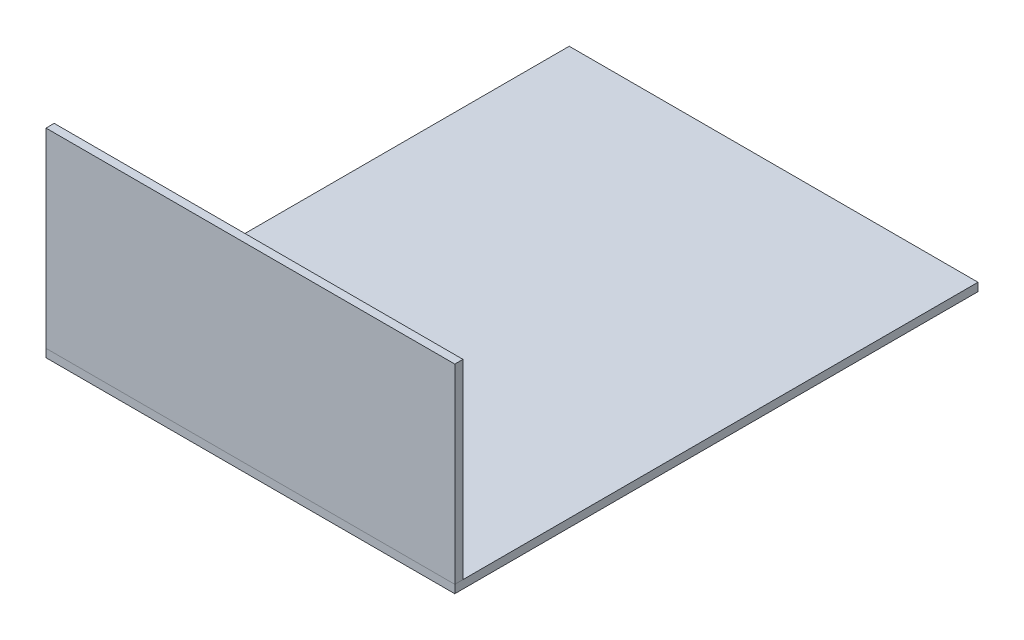
ISO-10303-21;
HEADER;
FILE_DESCRIPTION(('STEP AP214'),'2;1');
FILE_NAME('part.step','',(''),(''),'','','');
FILE_SCHEMA(('AUTOMOTIVE_DESIGN { 1 0 10303 214 1 1 1 1 }'));
ENDSEC;
DATA;
#1=APPLICATION_CONTEXT('core data for automotive mechanical design processes');
#2=APPLICATION_PROTOCOL_DEFINITION('international standard','automotive_design',2000,#1);
#3=PRODUCT_CONTEXT('',#1,'mechanical');
#4=PRODUCT('Part','Part','',(#3));
#5=PRODUCT_RELATED_PRODUCT_CATEGORY('part','',(#4));
#6=PRODUCT_DEFINITION_FORMATION('','',#4);
#7=PRODUCT_DEFINITION_CONTEXT('part definition',#1,'design');
#8=PRODUCT_DEFINITION('design','',#6,#7);
#9=PRODUCT_DEFINITION_SHAPE('','',#8);
#10=(LENGTH_UNIT() NAMED_UNIT(*) SI_UNIT(.MILLI.,.METRE.));
#11=(NAMED_UNIT(*) PLANE_ANGLE_UNIT() SI_UNIT($,.RADIAN.));
#12=(NAMED_UNIT(*) SI_UNIT($,.STERADIAN.) SOLID_ANGLE_UNIT());
#13=UNCERTAINTY_MEASURE_WITH_UNIT(LENGTH_MEASURE(1.E-05),#10,'distance_accuracy_value','');
#14=(GEOMETRIC_REPRESENTATION_CONTEXT(3) GLOBAL_UNCERTAINTY_ASSIGNED_CONTEXT((#13)) GLOBAL_UNIT_ASSIGNED_CONTEXT((#10,
#11,#12)) REPRESENTATION_CONTEXT('',''));
#15=CARTESIAN_POINT('',(0.,0.,0.));
#16=DIRECTION('',(0.,0.,1.));
#17=DIRECTION('',(1.,0.,0.));
#18=AXIS2_PLACEMENT_3D('',#15,#16,#17);
#19=CARTESIAN_POINT('',(-150.,146.,192.));
#20=DIRECTION('',(1.,0.,0.));
#21=DIRECTION('',(0.,0.,-1.));
#22=AXIS2_PLACEMENT_3D('',#19,#20,#21);
#23=PLANE('',#22);
#24=DIRECTION('',(0.,0.,1.));
#25=VECTOR('',#24,1.);
#26=CARTESIAN_POINT('',(-150.,6.,192.));
#27=LINE('',#26,#25);
#28=CARTESIAN_POINT('',(-150.,6.,186.));
#29=VERTEX_POINT('',#28);
#30=CARTESIAN_POINT('',(-150.,6.,192.));
#31=VERTEX_POINT('',#30);
#32=EDGE_CURVE('E108',#29,#31,#27,.T.);
#33=ORIENTED_EDGE('',*,*,#32,.T.);
#34=DIRECTION('',(0.,-1.,0.));
#35=VECTOR('',#34,1.);
#36=CARTESIAN_POINT('',(-150.,146.,192.));
#37=LINE('',#36,#35);
#38=CARTESIAN_POINT('',(-150.,146.,192.));
#39=VERTEX_POINT('',#38);
#40=EDGE_CURVE('E12',#39,#31,#37,.T.);
#41=ORIENTED_EDGE('',*,*,#40,.F.);
#42=DIRECTION('',(0.,0.,1.));
#43=VECTOR('',#42,1.);
#44=CARTESIAN_POINT('',(-150.,146.,192.));
#45=LINE('',#44,#43);
#46=CARTESIAN_POINT('',(-150.,146.,186.));
#47=VERTEX_POINT('',#46);
#48=EDGE_CURVE('E96',#47,#39,#45,.T.);
#49=ORIENTED_EDGE('',*,*,#48,.F.);
#50=DIRECTION('',(0.,-1.,0.));
#51=VECTOR('',#50,1.);
#52=CARTESIAN_POINT('',(-150.,146.,186.));
#53=LINE('',#52,#51);
#54=EDGE_CURVE('E104',#47,#29,#53,.T.);
#55=ORIENTED_EDGE('',*,*,#54,.T.);
#56=EDGE_LOOP('',(#33,#41,#49,#55));
#57=FACE_BOUND('',#56,.T.);
#58=ADVANCED_FACE('F45',(#57),#23,.F.);
#59=CARTESIAN_POINT('',(-150.,146.,192.));
#60=DIRECTION('',(0.,0.,-1.));
#61=DIRECTION('',(-1.,0.,0.));
#62=AXIS2_PLACEMENT_3D('',#59,#60,#61);
#63=PLANE('',#62);
#64=DIRECTION('',(1.,0.,0.));
#65=VECTOR('',#64,1.);
#66=CARTESIAN_POINT('',(-150.,6.,192.));
#67=LINE('',#66,#65);
#68=CARTESIAN_POINT('',(150.,6.,192.));
#69=VERTEX_POINT('',#68);
#70=EDGE_CURVE('E100',#31,#69,#67,.T.);
#71=ORIENTED_EDGE('',*,*,#70,.T.);
#72=DIRECTION('',(0.,-1.,0.));
#73=VECTOR('',#72,1.);
#74=CARTESIAN_POINT('',(150.,146.,192.));
#75=LINE('',#74,#73);
#76=CARTESIAN_POINT('',(150.,146.,192.));
#77=VERTEX_POINT('',#76);
#78=EDGE_CURVE('E53',#77,#69,#75,.T.);
#79=ORIENTED_EDGE('',*,*,#78,.F.);
#80=DIRECTION('',(1.,0.,0.));
#81=VECTOR('',#80,1.);
#82=CARTESIAN_POINT('',(-150.,146.,192.));
#83=LINE('',#82,#81);
#84=EDGE_CURVE('E91',#39,#77,#83,.T.);
#85=ORIENTED_EDGE('',*,*,#84,.F.);
#86=ORIENTED_EDGE('',*,*,#40,.T.);
#87=EDGE_LOOP('',(#71,#79,#85,#86));
#88=FACE_BOUND('',#87,.T.);
#89=ADVANCED_FACE('F99',(#88),#63,.F.);
#90=CARTESIAN_POINT('',(150.,146.,192.));
#91=DIRECTION('',(-1.,0.,0.));
#92=DIRECTION('',(0.,0.,1.));
#93=AXIS2_PLACEMENT_3D('',#90,#91,#92);
#94=PLANE('',#93);
#95=DIRECTION('',(0.,0.,-1.));
#96=VECTOR('',#95,1.);
#97=CARTESIAN_POINT('',(150.,6.,192.));
#98=LINE('',#97,#96);
#99=CARTESIAN_POINT('',(150.,6.,186.));
#100=VERTEX_POINT('',#99);
#101=EDGE_CURVE('E78',#69,#100,#98,.T.);
#102=ORIENTED_EDGE('',*,*,#101,.T.);
#103=DIRECTION('',(0.,-1.,0.));
#104=VECTOR('',#103,1.);
#105=CARTESIAN_POINT('',(150.,146.,186.));
#106=LINE('',#105,#104);
#107=CARTESIAN_POINT('',(150.,146.,186.));
#108=VERTEX_POINT('',#107);
#109=EDGE_CURVE('E101',#108,#100,#106,.T.);
#110=ORIENTED_EDGE('',*,*,#109,.F.);
#111=DIRECTION('',(0.,0.,-1.));
#112=VECTOR('',#111,1.);
#113=CARTESIAN_POINT('',(150.,146.,192.));
#114=LINE('',#113,#112);
#115=EDGE_CURVE('E94',#77,#108,#114,.T.);
#116=ORIENTED_EDGE('',*,*,#115,.F.);
#117=ORIENTED_EDGE('',*,*,#78,.T.);
#118=EDGE_LOOP('',(#102,#110,#116,#117));
#119=FACE_BOUND('',#118,.T.);
#120=ADVANCED_FACE('F102',(#119),#94,.F.);
#121=CARTESIAN_POINT('',(-150.,146.,186.));
#122=DIRECTION('',(0.,0.,1.));
#123=DIRECTION('',(1.,0.,0.));
#124=AXIS2_PLACEMENT_3D('',#121,#122,#123);
#125=PLANE('',#124);
#126=DIRECTION('',(-1.,0.,0.));
#127=VECTOR('',#126,1.);
#128=CARTESIAN_POINT('',(-150.,6.,186.));
#129=LINE('',#128,#127);
#130=EDGE_CURVE('E84',#100,#29,#129,.T.);
#131=ORIENTED_EDGE('',*,*,#130,.T.);
#132=ORIENTED_EDGE('',*,*,#54,.F.);
#133=DIRECTION('',(-1.,0.,0.));
#134=VECTOR('',#133,1.);
#135=CARTESIAN_POINT('',(-150.,146.,186.));
#136=LINE('',#135,#134);
#137=EDGE_CURVE('E61',#108,#47,#136,.T.);
#138=ORIENTED_EDGE('',*,*,#137,.F.);
#139=ORIENTED_EDGE('',*,*,#109,.T.);
#140=EDGE_LOOP('',(#131,#132,#138,#139));
#141=FACE_BOUND('',#140,.T.);
#142=ADVANCED_FACE('F115',(#141),#125,.F.);
#143=CARTESIAN_POINT('',(0.,146.,0.));
#144=DIRECTION('',(0.,-1.,0.));
#145=DIRECTION('',(0.,0.,-1.));
#146=AXIS2_PLACEMENT_3D('',#143,#144,#145);
#147=PLANE('',#146);
#148=ORIENTED_EDGE('',*,*,#48,.T.);
#149=ORIENTED_EDGE('',*,*,#84,.T.);
#150=ORIENTED_EDGE('',*,*,#115,.T.);
#151=ORIENTED_EDGE('',*,*,#137,.T.);
#152=EDGE_LOOP('',(#148,#149,#150,#151));
#153=FACE_BOUND('',#152,.T.);
#154=ADVANCED_FACE('F92',(#153),#147,.F.);
#155=CARTESIAN_POINT('',(0.,6.,0.));
#156=DIRECTION('',(0.,-1.,0.));
#157=DIRECTION('',(0.,0.,-1.));
#158=AXIS2_PLACEMENT_3D('',#155,#156,#157);
#159=PLANE('',#158);
#160=ORIENTED_EDGE('',*,*,#32,.F.);
#161=ORIENTED_EDGE('',*,*,#130,.F.);
#162=ORIENTED_EDGE('',*,*,#101,.F.);
#163=ORIENTED_EDGE('',*,*,#70,.F.);
#164=EDGE_LOOP('',(#160,#161,#162,#163));
#165=FACE_BOUND('',#164,.T.);
#166=ADVANCED_FACE('F118',(#165),#159,.T.);
#167=CLOSED_SHELL('',(#58,#89,#120,#142,#154,#166));
#168=MANIFOLD_SOLID_BREP('B2',#167);
#169=CARTESIAN_POINT('',(150.,6.,-192.));
#170=DIRECTION('',(-1.,0.,0.));
#171=DIRECTION('',(0.,0.,1.));
#172=AXIS2_PLACEMENT_3D('',#169,#170,#171);
#173=PLANE('',#172);
#174=DIRECTION('',(0.,0.,-1.));
#175=VECTOR('',#174,1.);
#176=CARTESIAN_POINT('',(150.,0.,-192.));
#177=LINE('',#176,#175);
#178=CARTESIAN_POINT('',(150.,0.,192.));
#179=VERTEX_POINT('',#178);
#180=CARTESIAN_POINT('',(150.,0.,-192.));
#181=VERTEX_POINT('',#180);
#182=EDGE_CURVE('E232',#179,#181,#177,.T.);
#183=ORIENTED_EDGE('',*,*,#182,.T.);
#184=DIRECTION('',(0.,-1.,0.));
#185=VECTOR('',#184,1.);
#186=CARTESIAN_POINT('',(150.,6.,-192.));
#187=LINE('',#186,#185);
#188=CARTESIAN_POINT('',(150.,6.,-192.));
#189=VERTEX_POINT('',#188);
#190=EDGE_CURVE('E43',#189,#181,#187,.T.);
#191=ORIENTED_EDGE('',*,*,#190,.F.);
#192=DIRECTION('',(0.,0.,-1.));
#193=VECTOR('',#192,1.);
#194=CARTESIAN_POINT('',(150.,6.,-192.));
#195=LINE('',#194,#193);
#196=CARTESIAN_POINT('',(150.,6.,192.));
#197=VERTEX_POINT('',#196);
#198=EDGE_CURVE('E220',#197,#189,#195,.T.);
#199=ORIENTED_EDGE('',*,*,#198,.F.);
#200=DIRECTION('',(0.,-1.,0.));
#201=VECTOR('',#200,1.);
#202=CARTESIAN_POINT('',(150.,6.,192.));
#203=LINE('',#202,#201);
#204=EDGE_CURVE('E228',#197,#179,#203,.T.);
#205=ORIENTED_EDGE('',*,*,#204,.T.);
#206=EDGE_LOOP('',(#183,#191,#199,#205));
#207=FACE_BOUND('',#206,.T.);
#208=ADVANCED_FACE('F169',(#207),#173,.F.);
#209=CARTESIAN_POINT('',(-150.,6.,-192.));
#210=DIRECTION('',(0.,0.,1.));
#211=DIRECTION('',(1.,0.,0.));
#212=AXIS2_PLACEMENT_3D('',#209,#210,#211);
#213=PLANE('',#212);
#214=DIRECTION('',(-1.,0.,0.));
#215=VECTOR('',#214,1.);
#216=CARTESIAN_POINT('',(-150.,0.,-192.));
#217=LINE('',#216,#215);
#218=CARTESIAN_POINT('',(-150.,0.,-192.));
#219=VERTEX_POINT('',#218);
#220=EDGE_CURVE('E224',#181,#219,#217,.T.);
#221=ORIENTED_EDGE('',*,*,#220,.T.);
#222=DIRECTION('',(0.,-1.,0.));
#223=VECTOR('',#222,1.);
#224=CARTESIAN_POINT('',(-150.,6.,-192.));
#225=LINE('',#224,#223);
#226=CARTESIAN_POINT('',(-150.,6.,-192.));
#227=VERTEX_POINT('',#226);
#228=EDGE_CURVE('E177',#227,#219,#225,.T.);
#229=ORIENTED_EDGE('',*,*,#228,.F.);
#230=DIRECTION('',(-1.,0.,0.));
#231=VECTOR('',#230,1.);
#232=CARTESIAN_POINT('',(-150.,6.,-192.));
#233=LINE('',#232,#231);
#234=EDGE_CURVE('E215',#189,#227,#233,.T.);
#235=ORIENTED_EDGE('',*,*,#234,.F.);
#236=ORIENTED_EDGE('',*,*,#190,.T.);
#237=EDGE_LOOP('',(#221,#229,#235,#236));
#238=FACE_BOUND('',#237,.T.);
#239=ADVANCED_FACE('F223',(#238),#213,.F.);
#240=CARTESIAN_POINT('',(-150.,6.,-192.));
#241=DIRECTION('',(1.,0.,0.));
#242=DIRECTION('',(0.,0.,-1.));
#243=AXIS2_PLACEMENT_3D('',#240,#241,#242);
#244=PLANE('',#243);
#245=DIRECTION('',(0.,0.,1.));
#246=VECTOR('',#245,1.);
#247=CARTESIAN_POINT('',(-150.,0.,-192.));
#248=LINE('',#247,#246);
#249=CARTESIAN_POINT('',(-150.,0.,192.));
#250=VERTEX_POINT('',#249);
#251=EDGE_CURVE('E202',#219,#250,#248,.T.);
#252=ORIENTED_EDGE('',*,*,#251,.T.);
#253=DIRECTION('',(0.,-1.,0.));
#254=VECTOR('',#253,1.);
#255=CARTESIAN_POINT('',(-150.,6.,192.));
#256=LINE('',#255,#254);
#257=CARTESIAN_POINT('',(-150.,6.,192.));
#258=VERTEX_POINT('',#257);
#259=EDGE_CURVE('E225',#258,#250,#256,.T.);
#260=ORIENTED_EDGE('',*,*,#259,.F.);
#261=DIRECTION('',(0.,0.,1.));
#262=VECTOR('',#261,1.);
#263=CARTESIAN_POINT('',(-150.,6.,-192.));
#264=LINE('',#263,#262);
#265=EDGE_CURVE('E218',#227,#258,#264,.T.);
#266=ORIENTED_EDGE('',*,*,#265,.F.);
#267=ORIENTED_EDGE('',*,*,#228,.T.);
#268=EDGE_LOOP('',(#252,#260,#266,#267));
#269=FACE_BOUND('',#268,.T.);
#270=ADVANCED_FACE('F226',(#269),#244,.F.);
#271=CARTESIAN_POINT('',(-150.,6.,192.));
#272=DIRECTION('',(0.,0.,-1.));
#273=DIRECTION('',(-1.,0.,0.));
#274=AXIS2_PLACEMENT_3D('',#271,#272,#273);
#275=PLANE('',#274);
#276=DIRECTION('',(1.,0.,0.));
#277=VECTOR('',#276,1.);
#278=CARTESIAN_POINT('',(-150.,0.,192.));
#279=LINE('',#278,#277);
#280=EDGE_CURVE('E208',#250,#179,#279,.T.);
#281=ORIENTED_EDGE('',*,*,#280,.T.);
#282=ORIENTED_EDGE('',*,*,#204,.F.);
#283=DIRECTION('',(1.,0.,0.));
#284=VECTOR('',#283,1.);
#285=CARTESIAN_POINT('',(-150.,6.,192.));
#286=LINE('',#285,#284);
#287=EDGE_CURVE('E185',#258,#197,#286,.T.);
#288=ORIENTED_EDGE('',*,*,#287,.F.);
#289=ORIENTED_EDGE('',*,*,#259,.T.);
#290=EDGE_LOOP('',(#281,#282,#288,#289));
#291=FACE_BOUND('',#290,.T.);
#292=ADVANCED_FACE('F239',(#291),#275,.F.);
#293=CARTESIAN_POINT('',(0.,6.,0.));
#294=DIRECTION('',(0.,1.,0.));
#295=DIRECTION('',(0.,0.,1.));
#296=AXIS2_PLACEMENT_3D('',#293,#294,#295);
#297=PLANE('',#296);
#298=ORIENTED_EDGE('',*,*,#198,.T.);
#299=ORIENTED_EDGE('',*,*,#234,.T.);
#300=ORIENTED_EDGE('',*,*,#265,.T.);
#301=ORIENTED_EDGE('',*,*,#287,.T.);
#302=EDGE_LOOP('',(#298,#299,#300,#301));
#303=FACE_BOUND('',#302,.T.);
#304=ADVANCED_FACE('F216',(#303),#297,.T.);
#305=CARTESIAN_POINT('',(0.,0.,0.));
#306=DIRECTION('',(0.,1.,0.));
#307=DIRECTION('',(0.,0.,1.));
#308=AXIS2_PLACEMENT_3D('',#305,#306,#307);
#309=PLANE('',#308);
#310=ORIENTED_EDGE('',*,*,#182,.F.);
#311=ORIENTED_EDGE('',*,*,#280,.F.);
#312=ORIENTED_EDGE('',*,*,#251,.F.);
#313=ORIENTED_EDGE('',*,*,#220,.F.);
#314=EDGE_LOOP('',(#310,#311,#312,#313));
#315=FACE_BOUND('',#314,.T.);
#316=ADVANCED_FACE('F242',(#315),#309,.F.);
#317=CLOSED_SHELL('',(#208,#239,#270,#292,#304,#316));
#318=MANIFOLD_SOLID_BREP('B6',#317);
#319=ADVANCED_BREP_SHAPE_REPRESENTATION('',(#18,#168,#318),#14);
#320=SHAPE_DEFINITION_REPRESENTATION(#9,#319);
ENDSEC;
END-ISO-10303-21;
